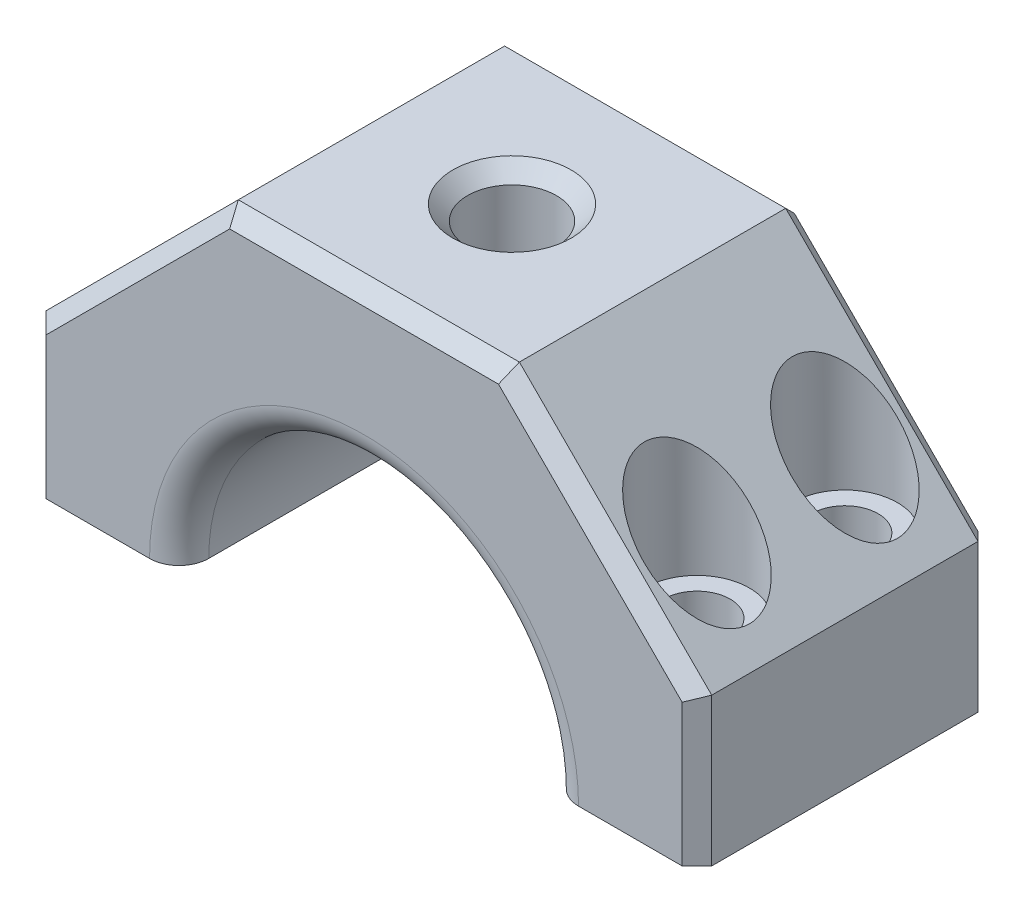
ISO-10303-21;
HEADER;
FILE_DESCRIPTION(('STEP AP214'),'2;1');
FILE_NAME('part.step','',(''),(''),'','','');
FILE_SCHEMA(('AUTOMOTIVE_DESIGN { 1 0 10303 214 1 1 1 1 }'));
ENDSEC;
DATA;
#1=APPLICATION_CONTEXT('core data for automotive mechanical design processes');
#2=APPLICATION_PROTOCOL_DEFINITION('international standard','automotive_design',2000,#1);
#3=PRODUCT_CONTEXT('',#1,'mechanical');
#4=PRODUCT('Part','Part','',(#3));
#5=PRODUCT_RELATED_PRODUCT_CATEGORY('part','',(#4));
#6=PRODUCT_DEFINITION_FORMATION('','',#4);
#7=PRODUCT_DEFINITION_CONTEXT('part definition',#1,'design');
#8=PRODUCT_DEFINITION('design','',#6,#7);
#9=PRODUCT_DEFINITION_SHAPE('','',#8);
#10=(LENGTH_UNIT() NAMED_UNIT(*) SI_UNIT(.MILLI.,.METRE.));
#11=(NAMED_UNIT(*) PLANE_ANGLE_UNIT() SI_UNIT($,.RADIAN.));
#12=(NAMED_UNIT(*) SI_UNIT($,.STERADIAN.) SOLID_ANGLE_UNIT());
#13=UNCERTAINTY_MEASURE_WITH_UNIT(LENGTH_MEASURE(1.E-05),#10,'distance_accuracy_value','');
#14=(GEOMETRIC_REPRESENTATION_CONTEXT(3) GLOBAL_UNCERTAINTY_ASSIGNED_CONTEXT((#13)) GLOBAL_UNIT_ASSIGNED_CONTEXT((#10,
#11,#12)) REPRESENTATION_CONTEXT('',''));
#15=CARTESIAN_POINT('',(0.,0.,0.));
#16=DIRECTION('',(0.,0.,1.));
#17=DIRECTION('',(1.,0.,0.));
#18=AXIS2_PLACEMENT_3D('',#15,#16,#17);
#19=CARTESIAN_POINT('',(17.5,23.001,-5.));
#20=DIRECTION('',(0.,-1.,0.));
#21=DIRECTION('',(0.,0.,-1.));
#22=AXIS2_PLACEMENT_3D('',#19,#20,#21);
#23=CYLINDRICAL_SURFACE('',#22,2.25);
#24=CARTESIAN_POINT('',(17.5,0.,-5.));
#25=DIRECTION('',(0.,-1.,0.));
#26=DIRECTION('',(0.,0.,1.));
#27=AXIS2_PLACEMENT_3D('',#24,#25,#26);
#28=CIRCLE('',#27,2.25);
#29=CARTESIAN_POINT('',(17.5,0.,-2.75));
#30=VERTEX_POINT('',#29);
#31=EDGE_CURVE('E220',#30,#30,#28,.T.);
#32=ORIENTED_EDGE('',*,*,#31,.T.);
#33=EDGE_LOOP('',(#32));
#34=FACE_BOUND('',#33,.T.);
#35=CARTESIAN_POINT('',(17.5,10.,-5.));
#36=DIRECTION('',(0.,1.,0.));
#37=DIRECTION('',(0.,0.,1.));
#38=AXIS2_PLACEMENT_3D('',#35,#36,#37);
#39=CIRCLE('',#38,2.25);
#40=CARTESIAN_POINT('',(17.5,10.,-2.75));
#41=VERTEX_POINT('',#40);
#42=EDGE_CURVE('E225',#41,#41,#39,.F.);
#43=ORIENTED_EDGE('',*,*,#42,.F.);
#44=EDGE_LOOP('',(#43));
#45=FACE_BOUND('',#44,.T.);
#46=ADVANCED_FACE('F40',(#34,#45),#23,.F.);
#47=CARTESIAN_POINT('',(17.5,23.001,5.));
#48=DIRECTION('',(0.,-1.,0.));
#49=DIRECTION('',(0.,0.,-1.));
#50=AXIS2_PLACEMENT_3D('',#47,#48,#49);
#51=CYLINDRICAL_SURFACE('',#50,2.25);
#52=CARTESIAN_POINT('',(17.5,0.,5.));
#53=DIRECTION('',(0.,-1.,0.));
#54=DIRECTION('',(0.,0.,1.));
#55=AXIS2_PLACEMENT_3D('',#52,#53,#54);
#56=CIRCLE('',#55,2.25);
#57=CARTESIAN_POINT('',(17.5,0.,7.25));
#58=VERTEX_POINT('',#57);
#59=EDGE_CURVE('E630',#58,#58,#56,.T.);
#60=ORIENTED_EDGE('',*,*,#59,.T.);
#61=EDGE_LOOP('',(#60));
#62=FACE_BOUND('',#61,.T.);
#63=CARTESIAN_POINT('',(17.5,10.,5.));
#64=DIRECTION('',(0.,1.,0.));
#65=DIRECTION('',(0.,0.,1.));
#66=AXIS2_PLACEMENT_3D('',#63,#64,#65);
#67=CIRCLE('',#66,2.25);
#68=CARTESIAN_POINT('',(17.5,10.,7.25));
#69=VERTEX_POINT('',#68);
#70=EDGE_CURVE('E221',#69,#69,#67,.F.);
#71=ORIENTED_EDGE('',*,*,#70,.F.);
#72=EDGE_LOOP('',(#71));
#73=FACE_BOUND('',#72,.T.);
#74=ADVANCED_FACE('F399',(#62,#73),#51,.F.);
#75=CARTESIAN_POINT('',(-17.5,23.001,-5.));
#76=DIRECTION('',(0.,-1.,0.));
#77=DIRECTION('',(0.,0.,-1.));
#78=AXIS2_PLACEMENT_3D('',#75,#76,#77);
#79=CYLINDRICAL_SURFACE('',#78,2.25);
#80=CARTESIAN_POINT('',(-17.5,0.,-5.));
#81=DIRECTION('',(0.,1.,0.));
#82=DIRECTION('',(0.,0.,1.));
#83=AXIS2_PLACEMENT_3D('',#80,#81,#82);
#84=CIRCLE('',#83,2.25);
#85=CARTESIAN_POINT('',(-17.5,0.,-2.75));
#86=VERTEX_POINT('',#85);
#87=EDGE_CURVE('E192',#86,#86,#84,.T.);
#88=ORIENTED_EDGE('',*,*,#87,.F.);
#89=EDGE_LOOP('',(#88));
#90=FACE_BOUND('',#89,.T.);
#91=CARTESIAN_POINT('',(-17.5,10.,-5.));
#92=DIRECTION('',(0.,1.,0.));
#93=DIRECTION('',(0.,0.,1.));
#94=AXIS2_PLACEMENT_3D('',#91,#92,#93);
#95=CIRCLE('',#94,2.25);
#96=CARTESIAN_POINT('',(-17.5,10.,-2.75));
#97=VERTEX_POINT('',#96);
#98=EDGE_CURVE('E215',#97,#97,#95,.T.);
#99=ORIENTED_EDGE('',*,*,#98,.T.);
#100=EDGE_LOOP('',(#99));
#101=FACE_BOUND('',#100,.T.);
#102=ADVANCED_FACE('F405',(#90,#101),#79,.F.);
#103=CARTESIAN_POINT('',(-17.5,23.001,5.));
#104=DIRECTION('',(0.,-1.,0.));
#105=DIRECTION('',(0.,0.,-1.));
#106=AXIS2_PLACEMENT_3D('',#103,#104,#105);
#107=CYLINDRICAL_SURFACE('',#106,2.25);
#108=CARTESIAN_POINT('',(-17.5,0.,5.));
#109=DIRECTION('',(0.,1.,0.));
#110=DIRECTION('',(0.,0.,1.));
#111=AXIS2_PLACEMENT_3D('',#108,#109,#110);
#112=CIRCLE('',#111,2.25);
#113=CARTESIAN_POINT('',(-17.5,0.,7.25));
#114=VERTEX_POINT('',#113);
#115=EDGE_CURVE('E185',#114,#114,#112,.T.);
#116=ORIENTED_EDGE('',*,*,#115,.F.);
#117=EDGE_LOOP('',(#116));
#118=FACE_BOUND('',#117,.T.);
#119=CARTESIAN_POINT('',(-17.5,10.,5.));
#120=DIRECTION('',(0.,1.,0.));
#121=DIRECTION('',(0.,0.,1.));
#122=AXIS2_PLACEMENT_3D('',#119,#120,#121);
#123=CIRCLE('',#122,2.25);
#124=CARTESIAN_POINT('',(-17.5,10.,7.25));
#125=VERTEX_POINT('',#124);
#126=EDGE_CURVE('E211',#125,#125,#123,.T.);
#127=ORIENTED_EDGE('',*,*,#126,.T.);
#128=EDGE_LOOP('',(#127));
#129=FACE_BOUND('',#128,.T.);
#130=ADVANCED_FACE('F412',(#118,#129),#107,.F.);
#131=CARTESIAN_POINT('',(0.,0.,0.));
#132=DIRECTION('',(0.,1.,0.));
#133=DIRECTION('',(0.,0.,1.));
#134=AXIS2_PLACEMENT_3D('',#131,#132,#133);
#135=PLANE('',#134);
#136=ORIENTED_EDGE('',*,*,#115,.T.);
#137=EDGE_LOOP('',(#136));
#138=FACE_BOUND('',#137,.T.);
#139=ORIENTED_EDGE('',*,*,#87,.T.);
#140=EDGE_LOOP('',(#139));
#141=FACE_BOUND('',#140,.T.);
#142=DIRECTION('',(1.,0.,0.));
#143=VECTOR('',#142,1.);
#144=CARTESIAN_POINT('',(-22.5,0.,10.));
#145=LINE('',#144,#143);
#146=CARTESIAN_POINT('',(-21.5,0.,10.));
#147=VERTEX_POINT('',#146);
#148=CARTESIAN_POINT('',(-14.5,0.,10.));
#149=VERTEX_POINT('',#148);
#150=EDGE_CURVE('E204',#147,#149,#145,.T.);
#151=ORIENTED_EDGE('',*,*,#150,.F.);
#152=DIRECTION('',(0.707106781186548,0.,0.707106781186548));
#153=VECTOR('',#152,1.);
#154=CARTESIAN_POINT('',(-21.5,0.,10.));
#155=LINE('',#154,#153);
#156=CARTESIAN_POINT('',(-22.5,0.,8.99999999999999));
#157=VERTEX_POINT('',#156);
#158=EDGE_CURVE('E330',#147,#157,#155,.F.);
#159=ORIENTED_EDGE('',*,*,#158,.T.);
#160=DIRECTION('',(0.,0.,1.));
#161=VECTOR('',#160,1.);
#162=CARTESIAN_POINT('',(-22.5,0.,-10.));
#163=LINE('',#162,#161);
#164=CARTESIAN_POINT('',(-22.5,0.,-9.));
#165=VERTEX_POINT('',#164);
#166=EDGE_CURVE('E199',#165,#157,#163,.T.);
#167=ORIENTED_EDGE('',*,*,#166,.F.);
#168=DIRECTION('',(-0.707106781186548,0.,0.707106781186548));
#169=VECTOR('',#168,1.);
#170=CARTESIAN_POINT('',(-22.5,0.,-9.));
#171=LINE('',#170,#169);
#172=CARTESIAN_POINT('',(-21.5,0.,-10.));
#173=VERTEX_POINT('',#172);
#174=EDGE_CURVE('E327',#165,#173,#171,.F.);
#175=ORIENTED_EDGE('',*,*,#174,.T.);
#176=DIRECTION('',(-1.,0.,0.));
#177=VECTOR('',#176,1.);
#178=CARTESIAN_POINT('',(0.,0.,-10.));
#179=LINE('',#178,#177);
#180=CARTESIAN_POINT('',(-14.5,0.,-10.));
#181=VERTEX_POINT('',#180);
#182=EDGE_CURVE('E189',#181,#173,#179,.T.);
#183=ORIENTED_EDGE('',*,*,#182,.F.);
#184=CARTESIAN_POINT('',(-14.5,0.,-8.));
#185=DIRECTION('',(0.,1.,0.));
#186=DIRECTION('',(0.,0.,1.));
#187=AXIS2_PLACEMENT_3D('',#184,#185,#186);
#188=CIRCLE('',#187,2.);
#189=CARTESIAN_POINT('',(-12.5,0.,-8.));
#190=VERTEX_POINT('',#189);
#191=EDGE_CURVE('E241',#181,#190,#188,.F.);
#192=ORIENTED_EDGE('',*,*,#191,.T.);
#193=DIRECTION('',(0.,0.,1.));
#194=VECTOR('',#193,1.);
#195=CARTESIAN_POINT('',(-12.5,0.,-10.001));
#196=LINE('',#195,#194);
#197=CARTESIAN_POINT('',(-12.5,0.,8.));
#198=VERTEX_POINT('',#197);
#199=EDGE_CURVE('E176',#198,#190,#196,.F.);
#200=ORIENTED_EDGE('',*,*,#199,.F.);
#201=CARTESIAN_POINT('',(-14.5,0.,8.));
#202=DIRECTION('',(0.,1.,0.));
#203=DIRECTION('',(0.,0.,1.));
#204=AXIS2_PLACEMENT_3D('',#201,#202,#203);
#205=CIRCLE('',#204,2.);
#206=EDGE_CURVE('E237',#198,#149,#205,.F.);
#207=ORIENTED_EDGE('',*,*,#206,.T.);
#208=EDGE_LOOP('',(#151,#159,#167,#175,#183,#192,#200,#207));
#209=FACE_BOUND('',#208,.T.);
#210=ADVANCED_FACE('F415',(#138,#141,#209),#135,.F.);
#211=CARTESIAN_POINT('',(0.,23.,-10.));
#212=DIRECTION('',(0.,0.,1.));
#213=DIRECTION('',(1.,0.,0.));
#214=AXIS2_PLACEMENT_3D('',#211,#212,#213);
#215=PLANE('',#214);
#216=DIRECTION('',(0.707106781186548,-0.707106781186548,0.));
#217=VECTOR('',#216,1.);
#218=CARTESIAN_POINT('',(21.7928932188135,9.29289321881341,-10.));
#219=LINE('',#218,#217);
#220=CARTESIAN_POINT('',(9.08578643762686,22.,-10.));
#221=VERTEX_POINT('',#220);
#222=CARTESIAN_POINT('',(21.5,9.58578643762686,-10.));
#223=VERTEX_POINT('',#222);
#224=EDGE_CURVE('E57',#221,#223,#219,.T.);
#225=ORIENTED_EDGE('',*,*,#224,.T.);
#226=DIRECTION('',(0.,-1.,0.));
#227=VECTOR('',#226,1.);
#228=CARTESIAN_POINT('',(21.5,23.,-10.));
#229=LINE('',#228,#227);
#230=CARTESIAN_POINT('',(21.5,0.,-10.));
#231=VERTEX_POINT('',#230);
#232=EDGE_CURVE('E349',#223,#231,#229,.T.);
#233=ORIENTED_EDGE('',*,*,#232,.T.);
#234=CARTESIAN_POINT('',(14.5,0.,-10.));
#235=VERTEX_POINT('',#234);
#236=EDGE_CURVE('E196',#231,#235,#179,.T.);
#237=ORIENTED_EDGE('',*,*,#236,.T.);
#238=CARTESIAN_POINT('',(0.,0.,-10.));
#239=DIRECTION('',(0.,0.,1.));
#240=DIRECTION('',(1.,0.,0.));
#241=AXIS2_PLACEMENT_3D('',#238,#239,#240);
#242=CIRCLE('',#241,14.5);
#243=EDGE_CURVE('E161',#235,#181,#242,.T.);
#244=ORIENTED_EDGE('',*,*,#243,.T.);
#245=ORIENTED_EDGE('',*,*,#182,.T.);
#246=DIRECTION('',(0.,1.,0.));
#247=VECTOR('',#246,1.);
#248=CARTESIAN_POINT('',(-21.5,23.,-10.));
#249=LINE('',#248,#247);
#250=CARTESIAN_POINT('',(-21.5,9.58578643762686,-10.));
#251=VERTEX_POINT('',#250);
#252=EDGE_CURVE('E339',#173,#251,#249,.T.);
#253=ORIENTED_EDGE('',*,*,#252,.T.);
#254=DIRECTION('',(0.707106781186548,0.707106781186548,0.));
#255=VECTOR('',#254,1.);
#256=CARTESIAN_POINT('',(-8.7928932188134,22.2928932188135,-10.));
#257=LINE('',#256,#255);
#258=CARTESIAN_POINT('',(-9.08578643762685,22.,-10.));
#259=VERTEX_POINT('',#258);
#260=EDGE_CURVE('E342',#251,#259,#257,.T.);
#261=ORIENTED_EDGE('',*,*,#260,.T.);
#262=DIRECTION('',(1.,0.,0.));
#263=VECTOR('',#262,1.);
#264=CARTESIAN_POINT('',(9.49999999999996,22.,-10.));
#265=LINE('',#264,#263);
#266=EDGE_CURVE('E62',#259,#221,#265,.T.);
#267=ORIENTED_EDGE('',*,*,#266,.T.);
#268=EDGE_LOOP('',(#225,#233,#237,#244,#245,#253,#261,#267));
#269=FACE_BOUND('',#268,.T.);
#270=ADVANCED_FACE('F442',(#269),#215,.F.);
#271=CARTESIAN_POINT('',(-22.5,23.,-10.));
#272=DIRECTION('',(1.,0.,0.));
#273=DIRECTION('',(0.,0.,-1.));
#274=AXIS2_PLACEMENT_3D('',#271,#272,#273);
#275=PLANE('',#274);
#276=ORIENTED_EDGE('',*,*,#166,.T.);
#277=DIRECTION('',(0.,1.,0.));
#278=VECTOR('',#277,1.);
#279=CARTESIAN_POINT('',(-22.5,23.,8.99999999999999));
#280=LINE('',#279,#278);
#281=CARTESIAN_POINT('',(-22.5,9.99999999999995,8.99999999999999));
#282=VERTEX_POINT('',#281);
#283=EDGE_CURVE('E336',#157,#282,#280,.T.);
#284=ORIENTED_EDGE('',*,*,#283,.T.);
#285=DIRECTION('',(0.,0.,-1.));
#286=VECTOR('',#285,1.);
#287=CARTESIAN_POINT('',(-22.5,9.99999999999995,-10.));
#288=LINE('',#287,#286);
#289=CARTESIAN_POINT('',(-22.5,9.99999999999995,-9.));
#290=VERTEX_POINT('',#289);
#291=EDGE_CURVE('E259',#282,#290,#288,.T.);
#292=ORIENTED_EDGE('',*,*,#291,.T.);
#293=DIRECTION('',(0.,-1.,0.));
#294=VECTOR('',#293,1.);
#295=CARTESIAN_POINT('',(-22.5,23.,-9.));
#296=LINE('',#295,#294);
#297=EDGE_CURVE('E333',#290,#165,#296,.T.);
#298=ORIENTED_EDGE('',*,*,#297,.T.);
#299=EDGE_LOOP('',(#276,#284,#292,#298));
#300=FACE_BOUND('',#299,.T.);
#301=ADVANCED_FACE('F438',(#300),#275,.F.);
#302=CARTESIAN_POINT('',(-22.5,23.,10.));
#303=DIRECTION('',(0.,0.,-1.));
#304=DIRECTION('',(-1.,0.,0.));
#305=AXIS2_PLACEMENT_3D('',#302,#303,#304);
#306=PLANE('',#305);
#307=CARTESIAN_POINT('',(14.5,0.,10.));
#308=VERTEX_POINT('',#307);
#309=CARTESIAN_POINT('',(21.5,0.,10.));
#310=VERTEX_POINT('',#309);
#311=EDGE_CURVE('E203',#308,#310,#145,.T.);
#312=ORIENTED_EDGE('',*,*,#311,.T.);
#313=DIRECTION('',(0.,1.,0.));
#314=VECTOR('',#313,1.);
#315=CARTESIAN_POINT('',(21.5,23.,10.));
#316=LINE('',#315,#314);
#317=CARTESIAN_POINT('',(21.5,9.58578643762685,10.));
#318=VERTEX_POINT('',#317);
#319=EDGE_CURVE('E306',#310,#318,#316,.T.);
#320=ORIENTED_EDGE('',*,*,#319,.T.);
#321=DIRECTION('',(-0.707106781186548,0.707106781186548,0.));
#322=VECTOR('',#321,1.);
#323=CARTESIAN_POINT('',(8.79289321881339,22.2928932188135,10.));
#324=LINE('',#323,#322);
#325=CARTESIAN_POINT('',(9.08578643762685,22.,10.));
#326=VERTEX_POINT('',#325);
#327=EDGE_CURVE('E303',#318,#326,#324,.T.);
#328=ORIENTED_EDGE('',*,*,#327,.T.);
#329=DIRECTION('',(-1.,0.,0.));
#330=VECTOR('',#329,1.);
#331=CARTESIAN_POINT('',(-9.49999999999996,22.,10.));
#332=LINE('',#331,#330);
#333=CARTESIAN_POINT('',(-9.08578643762686,22.,10.));
#334=VERTEX_POINT('',#333);
#335=EDGE_CURVE('E300',#326,#334,#332,.T.);
#336=ORIENTED_EDGE('',*,*,#335,.T.);
#337=DIRECTION('',(-0.707106781186548,-0.707106781186548,0.));
#338=VECTOR('',#337,1.);
#339=CARTESIAN_POINT('',(-21.7928932188134,9.2928932188134,10.));
#340=LINE('',#339,#338);
#341=CARTESIAN_POINT('',(-21.5,9.58578643762686,10.));
#342=VERTEX_POINT('',#341);
#343=EDGE_CURVE('E297',#334,#342,#340,.T.);
#344=ORIENTED_EDGE('',*,*,#343,.T.);
#345=DIRECTION('',(0.,-1.,0.));
#346=VECTOR('',#345,1.);
#347=CARTESIAN_POINT('',(-21.5,23.,10.));
#348=LINE('',#347,#346);
#349=EDGE_CURVE('E294',#342,#147,#348,.T.);
#350=ORIENTED_EDGE('',*,*,#349,.T.);
#351=ORIENTED_EDGE('',*,*,#150,.T.);
#352=CARTESIAN_POINT('',(0.,0.,10.));
#353=DIRECTION('',(0.,0.,-1.));
#354=DIRECTION('',(-1.,0.,0.));
#355=AXIS2_PLACEMENT_3D('',#352,#353,#354);
#356=CIRCLE('',#355,14.5);
#357=EDGE_CURVE('E244',#149,#308,#356,.T.);
#358=ORIENTED_EDGE('',*,*,#357,.T.);
#359=EDGE_LOOP('',(#312,#320,#328,#336,#344,#350,#351,#358));
#360=FACE_BOUND('',#359,.T.);
#361=ADVANCED_FACE('F434',(#360),#306,.F.);
#362=CARTESIAN_POINT('',(22.5,23.,10.));
#363=DIRECTION('',(-1.,0.,0.));
#364=DIRECTION('',(0.,0.,1.));
#365=AXIS2_PLACEMENT_3D('',#362,#363,#364);
#366=PLANE('',#365);
#367=DIRECTION('',(0.,0.,1.));
#368=VECTOR('',#367,1.);
#369=CARTESIAN_POINT('',(22.5,9.99999999999995,10.));
#370=LINE('',#369,#368);
#371=CARTESIAN_POINT('',(22.5,9.99999999999995,-9.));
#372=VERTEX_POINT('',#371);
#373=CARTESIAN_POINT('',(22.5,9.99999999999995,8.99999999999999));
#374=VERTEX_POINT('',#373);
#375=EDGE_CURVE('E255',#372,#374,#370,.T.);
#376=ORIENTED_EDGE('',*,*,#375,.T.);
#377=DIRECTION('',(0.,-1.,0.));
#378=VECTOR('',#377,1.);
#379=CARTESIAN_POINT('',(22.5,23.,8.99999999999999));
#380=LINE('',#379,#378);
#381=CARTESIAN_POINT('',(22.5,0.,8.99999999999999));
#382=VERTEX_POINT('',#381);
#383=EDGE_CURVE('E284',#374,#382,#380,.T.);
#384=ORIENTED_EDGE('',*,*,#383,.T.);
#385=DIRECTION('',(0.,0.,-1.));
#386=VECTOR('',#385,1.);
#387=CARTESIAN_POINT('',(22.5,0.,10.));
#388=LINE('',#387,#386);
#389=CARTESIAN_POINT('',(22.5,0.,-9.));
#390=VERTEX_POINT('',#389);
#391=EDGE_CURVE('E207',#382,#390,#388,.T.);
#392=ORIENTED_EDGE('',*,*,#391,.T.);
#393=DIRECTION('',(0.,1.,0.));
#394=VECTOR('',#393,1.);
#395=CARTESIAN_POINT('',(22.5,23.,-9.));
#396=LINE('',#395,#394);
#397=EDGE_CURVE('E263',#390,#372,#396,.T.);
#398=ORIENTED_EDGE('',*,*,#397,.T.);
#399=EDGE_LOOP('',(#376,#384,#392,#398));
#400=FACE_BOUND('',#399,.T.);
#401=ADVANCED_FACE('F427',(#400),#366,.F.);
#402=CARTESIAN_POINT('',(0.,23.,0.));
#403=DIRECTION('',(0.,1.,0.));
#404=DIRECTION('',(0.,0.,1.));
#405=AXIS2_PLACEMENT_3D('',#402,#403,#404);
#406=PLANE('',#405);
#407=CARTESIAN_POINT('',(0.,23.,0.));
#408=DIRECTION('',(0.,1.,0.));
#409=DIRECTION('',(0.,0.,1.));
#410=AXIS2_PLACEMENT_3D('',#407,#408,#409);
#411=CIRCLE('',#410,4.);
#412=CARTESIAN_POINT('',(0.,23.,4.));
#413=VERTEX_POINT('',#412);
#414=EDGE_CURVE('E11',#413,#413,#411,.F.);
#415=ORIENTED_EDGE('',*,*,#414,.T.);
#416=EDGE_LOOP('',(#415));
#417=FACE_BOUND('',#416,.T.);
#418=DIRECTION('',(0.,0.,1.));
#419=VECTOR('',#418,1.);
#420=CARTESIAN_POINT('',(-9.49999999999995,23.,10.));
#421=LINE('',#420,#419);
#422=CARTESIAN_POINT('',(-9.49999999999995,23.,-9.));
#423=VERTEX_POINT('',#422);
#424=CARTESIAN_POINT('',(-9.49999999999995,23.,8.99999999999999));
#425=VERTEX_POINT('',#424);
#426=EDGE_CURVE('E247',#423,#425,#421,.T.);
#427=ORIENTED_EDGE('',*,*,#426,.T.);
#428=DIRECTION('',(1.,0.,0.));
#429=VECTOR('',#428,1.);
#430=CARTESIAN_POINT('',(9.49999999999994,23.,8.99999999999999));
#431=LINE('',#430,#429);
#432=CARTESIAN_POINT('',(9.49999999999995,23.,8.99999999999999));
#433=VERTEX_POINT('',#432);
#434=EDGE_CURVE('E318',#425,#433,#431,.T.);
#435=ORIENTED_EDGE('',*,*,#434,.T.);
#436=DIRECTION('',(0.,0.,-1.));
#437=VECTOR('',#436,1.);
#438=CARTESIAN_POINT('',(9.49999999999995,23.,-10.));
#439=LINE('',#438,#437);
#440=CARTESIAN_POINT('',(9.49999999999995,23.,-9.));
#441=VERTEX_POINT('',#440);
#442=EDGE_CURVE('E251',#433,#441,#439,.T.);
#443=ORIENTED_EDGE('',*,*,#442,.T.);
#444=DIRECTION('',(-1.,0.,0.));
#445=VECTOR('',#444,1.);
#446=CARTESIAN_POINT('',(-9.49999999999994,23.,-9.));
#447=LINE('',#446,#445);
#448=EDGE_CURVE('E315',#441,#423,#447,.T.);
#449=ORIENTED_EDGE('',*,*,#448,.T.);
#450=EDGE_LOOP('',(#427,#435,#443,#449));
#451=FACE_BOUND('',#450,.T.);
#452=ADVANCED_FACE('F424',(#417,#451),#406,.T.);
#453=ORIENTED_EDGE('',*,*,#59,.F.);
#454=EDGE_LOOP('',(#453));
#455=FACE_BOUND('',#454,.T.);
#456=ORIENTED_EDGE('',*,*,#31,.F.);
#457=EDGE_LOOP('',(#456));
#458=FACE_BOUND('',#457,.T.);
#459=ORIENTED_EDGE('',*,*,#391,.F.);
#460=DIRECTION('',(0.707106781186548,0.,-0.707106781186548));
#461=VECTOR('',#460,1.);
#462=CARTESIAN_POINT('',(22.5,0.,8.99999999999999));
#463=LINE('',#462,#461);
#464=EDGE_CURVE('E291',#382,#310,#463,.F.);
#465=ORIENTED_EDGE('',*,*,#464,.T.);
#466=ORIENTED_EDGE('',*,*,#311,.F.);
#467=CARTESIAN_POINT('',(14.5,0.,8.));
#468=DIRECTION('',(0.,1.,0.));
#469=DIRECTION('',(0.,0.,1.));
#470=AXIS2_PLACEMENT_3D('',#467,#468,#469);
#471=CIRCLE('',#470,2.);
#472=CARTESIAN_POINT('',(12.5,0.,8.));
#473=VERTEX_POINT('',#472);
#474=EDGE_CURVE('E166',#308,#473,#471,.F.);
#475=ORIENTED_EDGE('',*,*,#474,.T.);
#476=DIRECTION('',(0.,0.,1.));
#477=VECTOR('',#476,1.);
#478=CARTESIAN_POINT('',(12.5,0.,-10.001));
#479=LINE('',#478,#477);
#480=CARTESIAN_POINT('',(12.5,0.,-8.));
#481=VERTEX_POINT('',#480);
#482=EDGE_CURVE('E173',#481,#473,#479,.T.);
#483=ORIENTED_EDGE('',*,*,#482,.F.);
#484=CARTESIAN_POINT('',(14.5,0.,-8.));
#485=DIRECTION('',(0.,1.,0.));
#486=DIRECTION('',(0.,0.,1.));
#487=AXIS2_PLACEMENT_3D('',#484,#485,#486);
#488=CIRCLE('',#487,2.);
#489=EDGE_CURVE('E156',#481,#235,#488,.F.);
#490=ORIENTED_EDGE('',*,*,#489,.T.);
#491=ORIENTED_EDGE('',*,*,#236,.F.);
#492=DIRECTION('',(-0.707106781186548,0.,-0.707106781186548));
#493=VECTOR('',#492,1.);
#494=CARTESIAN_POINT('',(21.5,0.,-10.));
#495=LINE('',#494,#493);
#496=EDGE_CURVE('E288',#231,#390,#495,.F.);
#497=ORIENTED_EDGE('',*,*,#496,.T.);
#498=EDGE_LOOP('',(#459,#465,#466,#475,#483,#490,#491,#497));
#499=FACE_BOUND('',#498,.T.);
#500=ADVANCED_FACE('F181',(#455,#458,#499),#135,.F.);
#501=CARTESIAN_POINT('',(0.,0.,-10.001));
#502=DIRECTION('',(0.,0.,1.));
#503=DIRECTION('',(1.,0.,0.));
#504=AXIS2_PLACEMENT_3D('',#501,#502,#503);
#505=CYLINDRICAL_SURFACE('',#504,12.5);
#506=CARTESIAN_POINT('',(0.,12.5,3.));
#507=CARTESIAN_POINT('',(-0.165963929028716,12.4999970714968,2.99999497592273));
#508=CARTESIAN_POINT('',(-0.331985420928067,12.4966615634859,2.98618158976393));
#509=CARTESIAN_POINT('',(-0.65928429097138,12.4836783946933,2.93136726040462));
#510=CARTESIAN_POINT('',(-0.820558683214274,12.4740268462166,2.89034957200532));
#511=CARTESIAN_POINT('',(-1.13358839471402,12.4494823208195,2.78250766549564));
#512=CARTESIAN_POINT('',(-1.28535442324822,12.4345953702841,2.71571311014241));
#513=CARTESIAN_POINT('',(-1.57552517879763,12.4011725442513,2.55831456355411));
#514=CARTESIAN_POINT('',(-1.71392971475166,12.3826366165873,2.46771023192274));
#515=CARTESIAN_POINT('',(-1.97609263393972,12.3435386014785,2.26343582162447));
#516=CARTESIAN_POINT('',(-2.0995595210048,12.3229472454311,2.14939721895074));
#517=CARTESIAN_POINT('',(-2.32581080811943,12.2822574370147,1.90228113093536));
#518=CARTESIAN_POINT('',(-2.42859304624489,12.2621590363612,1.76920165795905));
#519=CARTESIAN_POINT('',(-2.61189993555015,12.224437969062,1.48555416698255));
#520=CARTESIAN_POINT('',(-2.69210377047565,12.2068525815312,1.33477341624116));
#521=CARTESIAN_POINT('',(-2.82591582947332,12.1765733412448,1.02138016487152));
#522=CARTESIAN_POINT('',(-2.87952794169564,12.1638787734309,0.858769397976847));
#523=CARTESIAN_POINT('',(-2.95765058108663,12.1451184675007,0.529523426731099));
#524=CARTESIAN_POINT('',(-2.98268262400616,12.1389341034343,0.363018878474495));
#525=CARTESIAN_POINT('',(-3.00455808879087,12.1335389605945,0.0280676203572451));
#526=CARTESIAN_POINT('',(-3.00140571682399,12.1343271412568,-0.140378795956919));
#527=CARTESIAN_POINT('',(-2.96741912081942,12.1426811387008,-0.470475966012878));
#528=CARTESIAN_POINT('',(-2.93720103400494,12.1500960921292,-0.632194565189553));
#529=CARTESIAN_POINT('',(-2.85092141637189,12.1706283738785,-0.948197316647833));
#530=CARTESIAN_POINT('',(-2.79485817372027,12.1837460799133,-1.10248097573443));
#531=CARTESIAN_POINT('',(-2.65794121231782,12.2143476734445,-1.40091297808435));
#532=CARTESIAN_POINT('',(-2.5768594824696,12.2318714325758,-1.54495245291669));
#533=CARTESIAN_POINT('',(-2.39236688956383,12.2692875046197,-1.81760450072258));
#534=CARTESIAN_POINT('',(-2.28895240342647,12.2891802016137,-1.94621456528511));
#535=CARTESIAN_POINT('',(-2.05951493908847,12.329732025739,-2.18789357031874));
#536=CARTESIAN_POINT('',(-1.93297064389909,12.3503975788014,-2.30046709906221));
#537=CARTESIAN_POINT('',(-1.66255592459692,12.3896951594929,-2.50288471974638));
#538=CARTESIAN_POINT('',(-1.51868504982141,12.4083271342049,-2.59272822029261));
#539=CARTESIAN_POINT('',(-1.21702847718581,12.4415394956922,-2.74729722061278));
#540=CARTESIAN_POINT('',(-1.05920278696055,12.4561077058019,-2.81194745623779));
#541=CARTESIAN_POINT('',(-0.734497606078678,12.4794620474154,-2.91366507904859));
#542=CARTESIAN_POINT('',(-0.567619713387664,12.4882491958651,-2.95073731762681));
#543=CARTESIAN_POINT('',(-0.233787399651667,12.4989027542709,-2.99550206465204));
#544=CARTESIAN_POINT('',(-0.0669284805450101,12.5009282130753,-3.00386989246157));
#545=CARTESIAN_POINT('',(0.265804381586627,12.4982807419474,-2.9928332331491));
#546=CARTESIAN_POINT('',(0.43167840476495,12.4936083648176,-2.97343103801277));
#547=CARTESIAN_POINT('',(0.755422580108845,12.4781916395217,-2.90796302148362));
#548=CARTESIAN_POINT('',(0.913370579311301,12.4675301590363,-2.8622608904262));
#549=CARTESIAN_POINT('',(1.21935330013476,12.4413335015664,-2.74590180830474));
#550=CARTESIAN_POINT('',(1.3673870666415,12.4257978558334,-2.6752424570219));
#551=CARTESIAN_POINT('',(1.6520615099557,12.3911910149582,-2.50963340640215));
#552=CARTESIAN_POINT('',(1.78847176740355,12.3720653178033,-2.41429928307563));
#553=CARTESIAN_POINT('',(2.04359904096632,12.3324936406987,-2.20254307098659));
#554=CARTESIAN_POINT('',(2.16231325074336,12.3120474520734,-2.08611764391922));
#555=CARTESIAN_POINT('',(2.38142453789941,12.2715742142771,-1.83235916879145));
#556=CARTESIAN_POINT('',(2.48134974047369,12.2515669262668,-1.6946148779179));
#557=CARTESIAN_POINT('',(2.65666020824081,12.2147538797452,-1.40390957210327));
#558=CARTESIAN_POINT('',(2.7320465722335,12.1979479778962,-1.25094923890653));
#559=CARTESIAN_POINT('',(2.85558993518171,12.1696189519335,-0.934987486456014));
#560=CARTESIAN_POINT('',(2.90390754385905,12.1580647463107,-0.772051796578774));
#561=CARTESIAN_POINT('',(2.97238380283979,12.1415072663683,-0.440053814979308));
#562=CARTESIAN_POINT('',(2.99254804274991,12.1365026916888,-0.270992746238227));
#563=CARTESIAN_POINT('',(3.00387066449353,12.1337046220624,0.0636707002805973));
#564=CARTESIAN_POINT('',(2.99578106592266,12.1357241633848,0.229246496326692));
#565=CARTESIAN_POINT('',(2.95253345626268,12.1463176460425,0.55659976422369));
#566=CARTESIAN_POINT('',(2.91737590900096,12.1548914750658,0.718377301111353));
#567=CARTESIAN_POINT('',(2.82138591303537,12.1775274976748,1.03279755254825));
#568=CARTESIAN_POINT('',(2.76068402045612,12.191561756094,1.18548227258375));
#569=CARTESIAN_POINT('',(2.61543373580583,12.2235433612686,1.47860441388369));
#570=CARTESIAN_POINT('',(2.53088229934855,12.2414912075257,1.61904026858635));
#571=CARTESIAN_POINT('',(2.33793007708464,12.279819325529,1.88733700011951));
#572=CARTESIAN_POINT('',(2.22900267979018,12.3002478697533,2.01481232309873));
#573=CARTESIAN_POINT('',(1.99143074773237,12.3409359831145,2.24991998805192));
#574=CARTESIAN_POINT('',(1.86278158874234,12.361195511444,2.35754766321024));
#575=CARTESIAN_POINT('',(1.5868829988014,12.3996570299581,2.55160925955475));
#576=CARTESIAN_POINT('',(1.43936414359402,12.4178200201219,2.637668405442));
#577=CARTESIAN_POINT('',(1.13153622828567,12.4496380610582,2.78362953274789));
#578=CARTESIAN_POINT('',(0.971236973691223,12.4632965272855,2.84355134339162));
#579=CARTESIAN_POINT('',(0.675887025694769,12.4824059901497,2.92603862513779));
#580=CARTESIAN_POINT('',(0.542312066268424,12.4889599449579,2.9537166157857));
#581=CARTESIAN_POINT('',(0.272504227478251,12.4977580149525,2.99069878085188));
#582=CARTESIAN_POINT('',(0.136271517915778,12.5000024045682,3.00000412522552));
#583=CARTESIAN_POINT('',(0.,12.5,3.));
#584=B_SPLINE_CURVE_WITH_KNOTS('',3,(#506,#507,#508,#509,#510,#511,#512,#513,#514,#515,#516,
#517,#518,#519,#520,#521,#522,#523,#524,#525,#526,#527,#528,#529,#530,#531,#532,#533,#534,#535,
#536,#537,#538,#539,#540,#541,#542,#543,#544,#545,#546,#547,#548,#549,#550,#551,#552,#553,#554,
#555,#556,#557,#558,#559,#560,#561,#562,#563,#564,#565,#566,#567,#568,#569,#570,#571,#572,#573,
#574,#575,#576,#577,#578,#579,#580,#581,#582,#583),.UNSPECIFIED.,.T.,.F.,(4,2,2,2,2,2,2,2,2,2,2,
2,2,2,2,2,2,2,2,2,2,2,2,2,2,2,2,2,2,2,2,2,2,2,2,2,2,2,4),(0.,0.497392599366678,
0.995091645758823,1.49221966408501,1.98935478998519,2.49500570148357,3.00070943533306,
3.51327262050848,4.02576083835037,4.5287399535911,5.03164400680465,5.52338274964838,
6.01515406709138,6.51154667521171,7.00801987450002,7.51749958381934,8.0269925475217,
8.53799614678203,9.04890983140415,9.54771776810825,10.0464845383097,10.5385143736981,
11.0305915421211,11.5308523313794,12.031192370573,12.5427824523192,13.0543496229377,
13.5628484119093,14.0712462285018,14.5662165454702,15.0611783809799,15.5536406351284,
16.0461657803879,16.5505844610431,17.0551215958269,17.5678974206352,18.0802835459069,
18.4887142303991,18.897118905514),.UNSPECIFIED.);
#585=CARTESIAN_POINT('',(0.,12.5,3.));
#586=VERTEX_POINT('',#585);
#587=EDGE_CURVE('E373',#586,#586,#584,.T.);
#588=ORIENTED_EDGE('',*,*,#587,.F.);
#589=EDGE_LOOP('',(#588));
#590=FACE_BOUND('',#589,.T.);
#591=ORIENTED_EDGE('',*,*,#199,.T.);
#592=CARTESIAN_POINT('',(0.,0.,-8.));
#593=DIRECTION('',(0.,0.,1.));
#594=DIRECTION('',(1.,0.,0.));
#595=AXIS2_PLACEMENT_3D('',#592,#593,#594);
#596=CIRCLE('',#595,12.5);
#597=EDGE_CURVE('E160',#190,#481,#596,.F.);
#598=ORIENTED_EDGE('',*,*,#597,.T.);
#599=ORIENTED_EDGE('',*,*,#482,.T.);
#600=CARTESIAN_POINT('',(0.,0.,8.));
#601=DIRECTION('',(0.,0.,-1.));
#602=DIRECTION('',(-1.,0.,0.));
#603=AXIS2_PLACEMENT_3D('',#600,#601,#602);
#604=CIRCLE('',#603,12.5);
#605=EDGE_CURVE('E178',#473,#198,#604,.F.);
#606=ORIENTED_EDGE('',*,*,#605,.T.);
#607=EDGE_LOOP('',(#591,#598,#599,#606));
#608=FACE_BOUND('',#607,.T.);
#609=ADVANCED_FACE('F171',(#590,#608),#505,.F.);
#610=CARTESIAN_POINT('',(-17.5,10.,5.));
#611=DIRECTION('',(0.,1.,0.));
#612=DIRECTION('',(0.,0.,1.));
#613=AXIS2_PLACEMENT_3D('',#610,#611,#612);
#614=CYLINDRICAL_SURFACE('',#613,3.55);
#615=CARTESIAN_POINT('',(-17.5,10.,5.));
#616=DIRECTION('',(0.,1.,0.));
#617=DIRECTION('',(0.,0.,1.));
#618=AXIS2_PLACEMENT_3D('',#615,#616,#617);
#619=CIRCLE('',#618,3.55);
#620=CARTESIAN_POINT('',(-17.5,10.,8.55));
#621=VERTEX_POINT('',#620);
#622=EDGE_CURVE('E277',#621,#621,#619,.T.);
#623=ORIENTED_EDGE('',*,*,#622,.F.);
#624=EDGE_LOOP('',(#623));
#625=FACE_BOUND('',#624,.T.);
#626=CARTESIAN_POINT('',(-17.5,15.,5.));
#627=DIRECTION('',(-0.707106781186547,0.707106781186547,0.));
#628=DIRECTION('',(0.707106781186548,0.707106781186548,0.));
#629=AXIS2_PLACEMENT_3D('',#626,#627,#628);
#630=ELLIPSE('',#629,5.02045814642449,3.55);
#631=CARTESIAN_POINT('',(-13.95,18.55,5.));
#632=VERTEX_POINT('',#631);
#633=EDGE_CURVE('E230',#632,#632,#630,.T.);
#634=ORIENTED_EDGE('',*,*,#633,.T.);
#635=EDGE_LOOP('',(#634));
#636=FACE_BOUND('',#635,.T.);
#637=ADVANCED_FACE('F422',(#625,#636),#614,.F.);
#638=CARTESIAN_POINT('',(-17.5,10.,5.));
#639=DIRECTION('',(0.,1.,0.));
#640=DIRECTION('',(0.,0.,1.));
#641=AXIS2_PLACEMENT_3D('',#638,#639,#640);
#642=PLANE('',#641);
#643=ORIENTED_EDGE('',*,*,#126,.F.);
#644=EDGE_LOOP('',(#643));
#645=FACE_BOUND('',#644,.T.);
#646=ORIENTED_EDGE('',*,*,#622,.T.);
#647=EDGE_LOOP('',(#646));
#648=FACE_BOUND('',#647,.T.);
#649=ADVANCED_FACE('F608',(#645,#648),#642,.T.);
#650=CARTESIAN_POINT('',(-17.5,10.,-5.));
#651=DIRECTION('',(0.,1.,0.));
#652=DIRECTION('',(0.,0.,1.));
#653=AXIS2_PLACEMENT_3D('',#650,#651,#652);
#654=CYLINDRICAL_SURFACE('',#653,3.55);
#655=CARTESIAN_POINT('',(-17.5,10.,-5.));
#656=DIRECTION('',(0.,1.,0.));
#657=DIRECTION('',(0.,0.,1.));
#658=AXIS2_PLACEMENT_3D('',#655,#656,#657);
#659=CIRCLE('',#658,3.55);
#660=CARTESIAN_POINT('',(-17.5,10.,-1.45));
#661=VERTEX_POINT('',#660);
#662=EDGE_CURVE('E216',#661,#661,#659,.T.);
#663=ORIENTED_EDGE('',*,*,#662,.F.);
#664=EDGE_LOOP('',(#663));
#665=FACE_BOUND('',#664,.T.);
#666=CARTESIAN_POINT('',(-17.5,15.,-5.));
#667=DIRECTION('',(-0.707106781186547,0.707106781186547,0.));
#668=DIRECTION('',(0.707106781186548,0.707106781186548,0.));
#669=AXIS2_PLACEMENT_3D('',#666,#667,#668);
#670=ELLIPSE('',#669,5.02045814642449,3.55);
#671=CARTESIAN_POINT('',(-13.95,18.55,-5.));
#672=VERTEX_POINT('',#671);
#673=EDGE_CURVE('E278',#672,#672,#670,.T.);
#674=ORIENTED_EDGE('',*,*,#673,.T.);
#675=EDGE_LOOP('',(#674));
#676=FACE_BOUND('',#675,.T.);
#677=ADVANCED_FACE('F604',(#665,#676),#654,.F.);
#678=CARTESIAN_POINT('',(-17.5,10.,-5.));
#679=DIRECTION('',(0.,1.,0.));
#680=DIRECTION('',(0.,0.,1.));
#681=AXIS2_PLACEMENT_3D('',#678,#679,#680);
#682=PLANE('',#681);
#683=ORIENTED_EDGE('',*,*,#98,.F.);
#684=EDGE_LOOP('',(#683));
#685=FACE_BOUND('',#684,.T.);
#686=ORIENTED_EDGE('',*,*,#662,.T.);
#687=EDGE_LOOP('',(#686));
#688=FACE_BOUND('',#687,.T.);
#689=ADVANCED_FACE('F597',(#685,#688),#682,.T.);
#690=CARTESIAN_POINT('',(17.5,10.,5.));
#691=DIRECTION('',(0.,1.,0.));
#692=DIRECTION('',(0.,0.,1.));
#693=AXIS2_PLACEMENT_3D('',#690,#691,#692);
#694=PLANE('',#693);
#695=CARTESIAN_POINT('',(17.5,10.,5.));
#696=DIRECTION('',(0.,-1.,0.));
#697=DIRECTION('',(0.,0.,1.));
#698=AXIS2_PLACEMENT_3D('',#695,#696,#697);
#699=CIRCLE('',#698,3.55);
#700=CARTESIAN_POINT('',(17.5,10.,8.55));
#701=VERTEX_POINT('',#700);
#702=EDGE_CURVE('E268',#701,#701,#699,.T.);
#703=ORIENTED_EDGE('',*,*,#702,.F.);
#704=EDGE_LOOP('',(#703));
#705=FACE_BOUND('',#704,.T.);
#706=ORIENTED_EDGE('',*,*,#70,.T.);
#707=EDGE_LOOP('',(#706));
#708=FACE_BOUND('',#707,.T.);
#709=ADVANCED_FACE('F594',(#705,#708),#694,.T.);
#710=CARTESIAN_POINT('',(17.5,10.,5.));
#711=DIRECTION('',(0.,1.,0.));
#712=DIRECTION('',(0.,0.,1.));
#713=AXIS2_PLACEMENT_3D('',#710,#711,#712);
#714=CYLINDRICAL_SURFACE('',#713,3.55);
#715=ORIENTED_EDGE('',*,*,#702,.T.);
#716=EDGE_LOOP('',(#715));
#717=FACE_BOUND('',#716,.T.);
#718=CARTESIAN_POINT('',(17.5,15.,5.));
#719=DIRECTION('',(0.707106781186547,0.707106781186547,0.));
#720=DIRECTION('',(-0.707106781186548,0.707106781186548,0.));
#721=AXIS2_PLACEMENT_3D('',#718,#719,#720);
#722=ELLIPSE('',#721,5.02045814642449,3.55);
#723=CARTESIAN_POINT('',(13.95,18.55,5.));
#724=VERTEX_POINT('',#723);
#725=EDGE_CURVE('E264',#724,#724,#722,.F.);
#726=ORIENTED_EDGE('',*,*,#725,.F.);
#727=EDGE_LOOP('',(#726));
#728=FACE_BOUND('',#727,.T.);
#729=ADVANCED_FACE('F589',(#717,#728),#714,.F.);
#730=CARTESIAN_POINT('',(17.5,10.,-5.));
#731=DIRECTION('',(0.,1.,0.));
#732=DIRECTION('',(0.,0.,1.));
#733=AXIS2_PLACEMENT_3D('',#730,#731,#732);
#734=PLANE('',#733);
#735=CARTESIAN_POINT('',(17.5,10.,-5.));
#736=DIRECTION('',(0.,-1.,0.));
#737=DIRECTION('',(0.,0.,1.));
#738=AXIS2_PLACEMENT_3D('',#735,#736,#737);
#739=CIRCLE('',#738,3.55);
#740=CARTESIAN_POINT('',(17.5,10.,-1.45));
#741=VERTEX_POINT('',#740);
#742=EDGE_CURVE('E226',#741,#741,#739,.T.);
#743=ORIENTED_EDGE('',*,*,#742,.F.);
#744=EDGE_LOOP('',(#743));
#745=FACE_BOUND('',#744,.T.);
#746=ORIENTED_EDGE('',*,*,#42,.T.);
#747=EDGE_LOOP('',(#746));
#748=FACE_BOUND('',#747,.T.);
#749=ADVANCED_FACE('F583',(#745,#748),#734,.T.);
#750=CARTESIAN_POINT('',(17.5,10.,-5.));
#751=DIRECTION('',(0.,1.,0.));
#752=DIRECTION('',(0.,0.,1.));
#753=AXIS2_PLACEMENT_3D('',#750,#751,#752);
#754=CYLINDRICAL_SURFACE('',#753,3.55);
#755=ORIENTED_EDGE('',*,*,#742,.T.);
#756=EDGE_LOOP('',(#755));
#757=FACE_BOUND('',#756,.T.);
#758=CARTESIAN_POINT('',(17.5,15.,-5.));
#759=DIRECTION('',(0.707106781186547,0.707106781186547,0.));
#760=DIRECTION('',(-0.707106781186548,0.707106781186548,0.));
#761=AXIS2_PLACEMENT_3D('',#758,#759,#760);
#762=ELLIPSE('',#761,5.02045814642449,3.55);
#763=CARTESIAN_POINT('',(13.95,18.55,-5.));
#764=VERTEX_POINT('',#763);
#765=EDGE_CURVE('E270',#764,#764,#762,.F.);
#766=ORIENTED_EDGE('',*,*,#765,.F.);
#767=EDGE_LOOP('',(#766));
#768=FACE_BOUND('',#767,.T.);
#769=ADVANCED_FACE('F449',(#757,#768),#754,.F.);
#770=CARTESIAN_POINT('',(0.,0.,-8.));
#771=DIRECTION('',(0.,0.,1.));
#772=DIRECTION('',(1.,0.,0.));
#773=AXIS2_PLACEMENT_3D('',#770,#771,#772);
#774=TOROIDAL_SURFACE('',#773,14.5,2.);
#775=ORIENTED_EDGE('',*,*,#191,.F.);
#776=ORIENTED_EDGE('',*,*,#243,.F.);
#777=ORIENTED_EDGE('',*,*,#489,.F.);
#778=ORIENTED_EDGE('',*,*,#597,.F.);
#779=EDGE_LOOP('',(#775,#776,#777,#778));
#780=FACE_BOUND('',#779,.T.);
#781=ADVANCED_FACE('F159',(#780),#774,.T.);
#782=CARTESIAN_POINT('',(0.,0.,8.));
#783=DIRECTION('',(0.,0.,-1.));
#784=DIRECTION('',(-1.,0.,0.));
#785=AXIS2_PLACEMENT_3D('',#782,#783,#784);
#786=TOROIDAL_SURFACE('',#785,14.5,2.);
#787=ORIENTED_EDGE('',*,*,#474,.F.);
#788=ORIENTED_EDGE('',*,*,#357,.F.);
#789=ORIENTED_EDGE('',*,*,#206,.F.);
#790=ORIENTED_EDGE('',*,*,#605,.F.);
#791=EDGE_LOOP('',(#787,#788,#789,#790));
#792=FACE_BOUND('',#791,.T.);
#793=ADVANCED_FACE('F448',(#792),#786,.T.);
#794=CARTESIAN_POINT('',(9.49999999999995,23.,0.));
#795=DIRECTION('',(0.707106781186547,0.707106781186547,0.));
#796=DIRECTION('',(0.,0.,1.));
#797=AXIS2_PLACEMENT_3D('',#794,#795,#796);
#798=PLANE('',#797);
#799=ORIENTED_EDGE('',*,*,#442,.F.);
#800=DIRECTION('',(0.707106781186548,-0.707106781186548,0.));
#801=VECTOR('',#800,1.);
#802=CARTESIAN_POINT('',(22.5,9.99999999999995,8.99999999999999));
#803=LINE('',#802,#801);
#804=EDGE_CURVE('E312',#433,#374,#803,.T.);
#805=ORIENTED_EDGE('',*,*,#804,.T.);
#806=ORIENTED_EDGE('',*,*,#375,.F.);
#807=DIRECTION('',(-0.707106781186548,0.707106781186548,0.));
#808=VECTOR('',#807,1.);
#809=CARTESIAN_POINT('',(9.49999999999996,23.,-9.));
#810=LINE('',#809,#808);
#811=EDGE_CURVE('E309',#372,#441,#810,.T.);
#812=ORIENTED_EDGE('',*,*,#811,.T.);
#813=EDGE_LOOP('',(#799,#805,#806,#812));
#814=FACE_BOUND('',#813,.T.);
#815=ORIENTED_EDGE('',*,*,#725,.T.);
#816=EDGE_LOOP('',(#815));
#817=FACE_BOUND('',#816,.T.);
#818=ORIENTED_EDGE('',*,*,#765,.T.);
#819=EDGE_LOOP('',(#818));
#820=FACE_BOUND('',#819,.T.);
#821=ADVANCED_FACE('F452',(#814,#817,#820),#798,.T.);
#822=CARTESIAN_POINT('',(-9.49999999999995,23.,0.));
#823=DIRECTION('',(-0.707106781186547,0.707106781186547,0.));
#824=DIRECTION('',(0.,0.,-1.));
#825=AXIS2_PLACEMENT_3D('',#822,#823,#824);
#826=PLANE('',#825);
#827=ORIENTED_EDGE('',*,*,#291,.F.);
#828=DIRECTION('',(0.707106781186548,0.707106781186548,0.));
#829=VECTOR('',#828,1.);
#830=CARTESIAN_POINT('',(-9.49999999999995,23.,8.99999999999999));
#831=LINE('',#830,#829);
#832=EDGE_CURVE('E324',#282,#425,#831,.T.);
#833=ORIENTED_EDGE('',*,*,#832,.T.);
#834=ORIENTED_EDGE('',*,*,#426,.F.);
#835=DIRECTION('',(-0.707106781186548,-0.707106781186548,0.));
#836=VECTOR('',#835,1.);
#837=CARTESIAN_POINT('',(-22.5,9.99999999999995,-9.));
#838=LINE('',#837,#836);
#839=EDGE_CURVE('E321',#423,#290,#838,.T.);
#840=ORIENTED_EDGE('',*,*,#839,.T.);
#841=EDGE_LOOP('',(#827,#833,#834,#840));
#842=FACE_BOUND('',#841,.T.);
#843=ORIENTED_EDGE('',*,*,#633,.F.);
#844=EDGE_LOOP('',(#843));
#845=FACE_BOUND('',#844,.T.);
#846=ORIENTED_EDGE('',*,*,#673,.F.);
#847=EDGE_LOOP('',(#846));
#848=FACE_BOUND('',#847,.T.);
#849=ADVANCED_FACE('F460',(#842,#845,#848),#826,.T.);
#850=CARTESIAN_POINT('',(-21.5,23.,10.));
#851=DIRECTION('',(0.707106781186547,0.,-0.707106781186547));
#852=DIRECTION('',(0.,-1.,0.));
#853=AXIS2_PLACEMENT_3D('',#850,#851,#852);
#854=PLANE('',#853);
#855=ORIENTED_EDGE('',*,*,#158,.F.);
#856=ORIENTED_EDGE('',*,*,#349,.F.);
#857=DIRECTION('',(0.678598344545847,-0.281084637714819,0.678598344545847));
#858=VECTOR('',#857,1.);
#859=CARTESIAN_POINT('',(-24.0586749813564,10.6456243166094,7.44132501864363));
#860=LINE('',#859,#858);
#861=EDGE_CURVE('E269',#282,#342,#860,.T.);
#862=ORIENTED_EDGE('',*,*,#861,.F.);
#863=ORIENTED_EDGE('',*,*,#283,.F.);
#864=EDGE_LOOP('',(#855,#856,#862,#863));
#865=FACE_BOUND('',#864,.T.);
#866=ADVANCED_FACE('F467',(#865),#854,.F.);
#867=CARTESIAN_POINT('',(-15.2928932188134,15.7928932188134,10.));
#868=DIRECTION('',(-0.5,0.5,0.707106781186547));
#869=DIRECTION('',(0.707106781186548,0.707106781186548,0.));
#870=AXIS2_PLACEMENT_3D('',#867,#868,#869);
#871=PLANE('',#870);
#872=ORIENTED_EDGE('',*,*,#861,.T.);
#873=ORIENTED_EDGE('',*,*,#343,.F.);
#874=DIRECTION('',(-0.281084637714819,0.678598344545847,-0.678598344545847));
#875=VECTOR('',#874,1.);
#876=CARTESIAN_POINT('',(-8.39223538457557,20.3256196415254,11.6743803584746));
#877=LINE('',#876,#875);
#878=EDGE_CURVE('E361',#425,#334,#877,.F.);
#879=ORIENTED_EDGE('',*,*,#878,.F.);
#880=ORIENTED_EDGE('',*,*,#832,.F.);
#881=EDGE_LOOP('',(#872,#873,#879,#880));
#882=FACE_BOUND('',#881,.T.);
#883=ADVANCED_FACE('F492',(#882),#871,.T.);
#884=CARTESIAN_POINT('',(0.,23.,8.99999999999999));
#885=DIRECTION('',(0.,0.707106781186547,0.707106781186547));
#886=DIRECTION('',(-1.,0.,0.));
#887=AXIS2_PLACEMENT_3D('',#884,#885,#886);
#888=PLANE('',#887);
#889=ORIENTED_EDGE('',*,*,#878,.T.);
#890=ORIENTED_EDGE('',*,*,#335,.F.);
#891=DIRECTION('',(0.281084637714823,0.678598344545846,-0.678598344545846));
#892=VECTOR('',#891,1.);
#893=CARTESIAN_POINT('',(8.74941855118686,21.1879360866098,10.8120639133902));
#894=LINE('',#893,#892);
#895=EDGE_CURVE('E356',#433,#326,#894,.F.);
#896=ORIENTED_EDGE('',*,*,#895,.F.);
#897=ORIENTED_EDGE('',*,*,#434,.F.);
#898=EDGE_LOOP('',(#889,#890,#896,#897));
#899=FACE_BOUND('',#898,.T.);
#900=ADVANCED_FACE('F485',(#899),#888,.T.);
#901=CARTESIAN_POINT('',(-7.20710678118658,38.2928932188134,10.));
#902=DIRECTION('',(0.499999999999999,0.499999999999999,0.707106781186549));
#903=DIRECTION('',(0.707106781186548,-0.707106781186548,0.));
#904=AXIS2_PLACEMENT_3D('',#901,#902,#903);
#905=PLANE('',#904);
#906=ORIENTED_EDGE('',*,*,#895,.T.);
#907=ORIENTED_EDGE('',*,*,#327,.F.);
#908=DIRECTION('',(-0.678598344545846,-0.281084637714823,0.678598344545846));
#909=VECTOR('',#908,1.);
#910=CARTESIAN_POINT('',(13.7561964152546,6.37819796847189,17.7438035847454));
#911=LINE('',#910,#909);
#912=EDGE_CURVE('E352',#374,#318,#911,.T.);
#913=ORIENTED_EDGE('',*,*,#912,.F.);
#914=ORIENTED_EDGE('',*,*,#804,.F.);
#915=EDGE_LOOP('',(#906,#907,#913,#914));
#916=FACE_BOUND('',#915,.T.);
#917=ADVANCED_FACE('F478',(#916),#905,.T.);
#918=CARTESIAN_POINT('',(22.5,23.,8.99999999999999));
#919=DIRECTION('',(-0.707106781186547,0.,-0.707106781186547));
#920=DIRECTION('',(0.,-1.,0.));
#921=AXIS2_PLACEMENT_3D('',#918,#919,#920);
#922=PLANE('',#921);
#923=ORIENTED_EDGE('',*,*,#912,.T.);
#924=ORIENTED_EDGE('',*,*,#319,.F.);
#925=ORIENTED_EDGE('',*,*,#464,.F.);
#926=ORIENTED_EDGE('',*,*,#383,.F.);
#927=EDGE_LOOP('',(#923,#924,#925,#926));
#928=FACE_BOUND('',#927,.T.);
#929=ADVANCED_FACE('F470',(#928),#922,.F.);
#930=CARTESIAN_POINT('',(-22.5,23.,-9.));
#931=DIRECTION('',(0.707106781186547,0.,0.707106781186547));
#932=DIRECTION('',(0.,-1.,0.));
#933=AXIS2_PLACEMENT_3D('',#930,#931,#932);
#934=PLANE('',#933);
#935=ORIENTED_EDGE('',*,*,#174,.F.);
#936=ORIENTED_EDGE('',*,*,#297,.F.);
#937=DIRECTION('',(-0.678598344545847,0.281084637714822,0.678598344545847));
#938=VECTOR('',#937,1.);
#939=CARTESIAN_POINT('',(-24.9796664077971,11.0271114562705,-6.52033359220288));
#940=LINE('',#939,#938);
#941=EDGE_CURVE('E357',#251,#290,#940,.T.);
#942=ORIENTED_EDGE('',*,*,#941,.F.);
#943=ORIENTED_EDGE('',*,*,#252,.F.);
#944=EDGE_LOOP('',(#935,#936,#942,#943));
#945=FACE_BOUND('',#944,.T.);
#946=ADVANCED_FACE('F477',(#945),#934,.F.);
#947=CARTESIAN_POINT('',(-4.04289321881343,27.0428932188134,-10.));
#948=DIRECTION('',(-0.5,0.5,-0.707106781186548));
#949=DIRECTION('',(-0.707106781186548,-0.707106781186548,0.));
#950=AXIS2_PLACEMENT_3D('',#947,#948,#949);
#951=PLANE('',#950);
#952=ORIENTED_EDGE('',*,*,#941,.T.);
#953=ORIENTED_EDGE('',*,*,#839,.F.);
#954=DIRECTION('',(0.281084637714822,-0.678598344545847,-0.678598344545847));
#955=VECTOR('',#954,1.);
#956=CARTESIAN_POINT('',(-9.64925409262741,23.3603312546609,-8.63966874533911));
#957=LINE('',#956,#955);
#958=EDGE_CURVE('E377',#259,#423,#957,.F.);
#959=ORIENTED_EDGE('',*,*,#958,.F.);
#960=ORIENTED_EDGE('',*,*,#260,.F.);
#961=EDGE_LOOP('',(#952,#953,#959,#960));
#962=FACE_BOUND('',#961,.T.);
#963=ADVANCED_FACE('F524',(#962),#951,.T.);
#964=CARTESIAN_POINT('',(0.,23.,-9.));
#965=DIRECTION('',(0.,0.707106781186547,-0.707106781186547));
#966=DIRECTION('',(1.,0.,0.));
#967=AXIS2_PLACEMENT_3D('',#964,#965,#966);
#968=PLANE('',#967);
#969=ORIENTED_EDGE('',*,*,#958,.T.);
#970=ORIENTED_EDGE('',*,*,#448,.F.);
#971=DIRECTION('',(-0.28108463771482,-0.678598344545847,-0.678598344545847));
#972=VECTOR('',#971,1.);
#973=CARTESIAN_POINT('',(8.74941855118688,21.1879360866098,-10.8120639133902));
#974=LINE('',#973,#972);
#975=EDGE_CURVE('E372',#221,#441,#974,.F.);
#976=ORIENTED_EDGE('',*,*,#975,.F.);
#977=ORIENTED_EDGE('',*,*,#266,.F.);
#978=EDGE_LOOP('',(#969,#970,#976,#977));
#979=FACE_BOUND('',#978,.T.);
#980=ADVANCED_FACE('F517',(#979),#968,.T.);
#981=CARTESIAN_POINT('',(4.04289321881343,27.0428932188134,-10.));
#982=DIRECTION('',(0.5,0.5,-0.707106781186547));
#983=DIRECTION('',(-0.707106781186548,0.707106781186548,0.));
#984=AXIS2_PLACEMENT_3D('',#981,#982,#983);
#985=PLANE('',#984);
#986=ORIENTED_EDGE('',*,*,#975,.T.);
#987=ORIENTED_EDGE('',*,*,#811,.F.);
#988=DIRECTION('',(0.678598344545847,0.28108463771482,0.678598344545847));
#989=VECTOR('',#988,1.);
#990=CARTESIAN_POINT('',(16.79090802839,7.63521667652374,-14.70909197161));
#991=LINE('',#990,#989);
#992=EDGE_CURVE('E368',#223,#372,#991,.T.);
#993=ORIENTED_EDGE('',*,*,#992,.F.);
#994=ORIENTED_EDGE('',*,*,#224,.F.);
#995=EDGE_LOOP('',(#986,#987,#993,#994));
#996=FACE_BOUND('',#995,.T.);
#997=ADVANCED_FACE('F510',(#996),#985,.T.);
#998=CARTESIAN_POINT('',(21.5,23.,-10.));
#999=DIRECTION('',(-0.707106781186547,0.,0.707106781186547));
#1000=DIRECTION('',(0.,-1.,0.));
#1001=AXIS2_PLACEMENT_3D('',#998,#999,#1000);
#1002=PLANE('',#1001);
#1003=ORIENTED_EDGE('',*,*,#992,.T.);
#1004=ORIENTED_EDGE('',*,*,#397,.F.);
#1005=ORIENTED_EDGE('',*,*,#496,.F.);
#1006=ORIENTED_EDGE('',*,*,#232,.F.);
#1007=EDGE_LOOP('',(#1003,#1004,#1005,#1006));
#1008=FACE_BOUND('',#1007,.T.);
#1009=ADVANCED_FACE('F395',(#1008),#1002,.F.);
#1010=CARTESIAN_POINT('',(0.,-0.001000000000001,0.));
#1011=DIRECTION('',(0.,1.,0.));
#1012=DIRECTION('',(0.,0.,1.));
#1013=AXIS2_PLACEMENT_3D('',#1010,#1011,#1012);
#1014=CYLINDRICAL_SURFACE('',#1013,3.);
#1015=CARTESIAN_POINT('',(0.,22.,0.));
#1016=DIRECTION('',(0.,1.,0.));
#1017=DIRECTION('',(0.,0.,1.));
#1018=AXIS2_PLACEMENT_3D('',#1015,#1016,#1017);
#1019=CIRCLE('',#1018,3.);
#1020=CARTESIAN_POINT('',(0.,22.,3.));
#1021=VERTEX_POINT('',#1020);
#1022=EDGE_CURVE('E50',#1021,#1021,#1019,.T.);
#1023=ORIENTED_EDGE('',*,*,#1022,.T.);
#1024=EDGE_LOOP('',(#1023));
#1025=FACE_BOUND('',#1024,.T.);
#1026=ORIENTED_EDGE('',*,*,#587,.T.);
#1027=EDGE_LOOP('',(#1026));
#1028=FACE_BOUND('',#1027,.T.);
#1029=ADVANCED_FACE('F387',(#1025,#1028),#1014,.F.);
#1030=CARTESIAN_POINT('',(0.,22.,0.));
#1031=DIRECTION('',(0.,1.,0.));
#1032=DIRECTION('',(0.,0.,1.));
#1033=AXIS2_PLACEMENT_3D('',#1030,#1031,#1032);
#1034=CONICAL_SURFACE('',#1033,3.,0.785398163397449);
#1035=ORIENTED_EDGE('',*,*,#414,.F.);
#1036=EDGE_LOOP('',(#1035));
#1037=FACE_BOUND('',#1036,.T.);
#1038=ORIENTED_EDGE('',*,*,#1022,.F.);
#1039=EDGE_LOOP('',(#1038));
#1040=FACE_BOUND('',#1039,.T.);
#1041=ADVANCED_FACE('F43',(#1037,#1040),#1034,.F.);
#1042=CLOSED_SHELL('',(#46,#74,#102,#130,#210,#270,#301,#361,#401,#452,#500,#609,#637,#649,#677,
#689,#709,#729,#749,#769,#781,#793,#821,#849,#866,#883,#900,#917,#929,#946,#963,#980,#997,#1009,
#1029,#1041));
#1043=MANIFOLD_SOLID_BREP('B2',#1042);
#1044=ADVANCED_BREP_SHAPE_REPRESENTATION('',(#18,#1043),#14);
#1045=SHAPE_DEFINITION_REPRESENTATION(#9,#1044);
ENDSEC;
END-ISO-10303-21;
